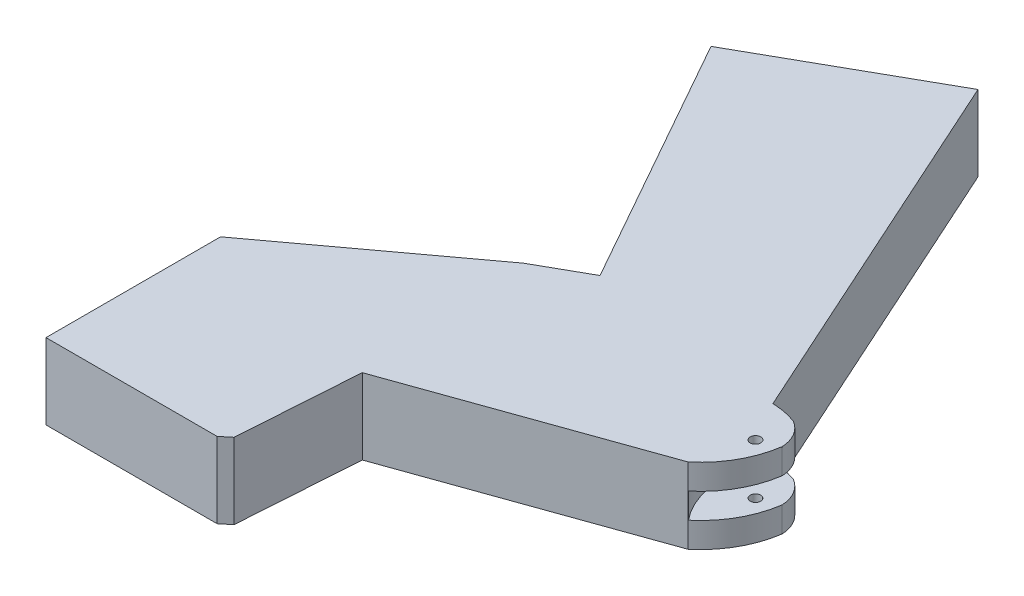
ISO-10303-21;
HEADER;
FILE_DESCRIPTION(('STEP AP214'),'2;1');
FILE_NAME('part.step','',(''),(''),'','','');
FILE_SCHEMA(('AUTOMOTIVE_DESIGN { 1 0 10303 214 1 1 1 1 }'));
ENDSEC;
DATA;
#1=APPLICATION_CONTEXT('core data for automotive mechanical design processes');
#2=APPLICATION_PROTOCOL_DEFINITION('international standard','automotive_design',2000,#1);
#3=PRODUCT_CONTEXT('',#1,'mechanical');
#4=PRODUCT('Part','Part','',(#3));
#5=PRODUCT_RELATED_PRODUCT_CATEGORY('part','',(#4));
#6=PRODUCT_DEFINITION_FORMATION('','',#4);
#7=PRODUCT_DEFINITION_CONTEXT('part definition',#1,'design');
#8=PRODUCT_DEFINITION('design','',#6,#7);
#9=PRODUCT_DEFINITION_SHAPE('','',#8);
#10=(LENGTH_UNIT() NAMED_UNIT(*) SI_UNIT(.MILLI.,.METRE.));
#11=(NAMED_UNIT(*) PLANE_ANGLE_UNIT() SI_UNIT($,.RADIAN.));
#12=(NAMED_UNIT(*) SI_UNIT($,.STERADIAN.) SOLID_ANGLE_UNIT());
#13=UNCERTAINTY_MEASURE_WITH_UNIT(LENGTH_MEASURE(1.E-05),#10,'distance_accuracy_value','');
#14=(GEOMETRIC_REPRESENTATION_CONTEXT(3) GLOBAL_UNCERTAINTY_ASSIGNED_CONTEXT((#13)) GLOBAL_UNIT_ASSIGNED_CONTEXT((#10,
#11,#12)) REPRESENTATION_CONTEXT('',''));
#15=CARTESIAN_POINT('',(0.,0.,0.));
#16=DIRECTION('',(0.,0.,1.));
#17=DIRECTION('',(1.,0.,0.));
#18=AXIS2_PLACEMENT_3D('',#15,#16,#17);
#19=CARTESIAN_POINT('',(-14.8493113907841,6.,2.40411681968589));
#20=DIRECTION('',(0.,-1.,0.));
#21=DIRECTION('',(0.,0.,-1.));
#22=AXIS2_PLACEMENT_3D('',#19,#20,#21);
#23=CYLINDRICAL_SURFACE('',#22,7.62);
#24=DIRECTION('',(0.,-1.,0.));
#25=VECTOR('',#24,1.);
#26=CARTESIAN_POINT('',(-7.30660623277179,7.07563292987973,3.4867057995369));
#27=LINE('',#26,#25);
#28=CARTESIAN_POINT('',(-7.30660623277179,6.,3.4867057995369));
#29=VERTEX_POINT('',#28);
#30=CARTESIAN_POINT('',(-7.30660623277179,4.,3.4867057995369));
#31=VERTEX_POINT('',#30);
#32=EDGE_CURVE('E209',#29,#31,#27,.T.);
#33=ORIENTED_EDGE('',*,*,#32,.F.);
#34=CARTESIAN_POINT('',(-14.8493113907841,6.,2.40411681968589));
#35=DIRECTION('',(0.,1.,0.));
#36=DIRECTION('',(0.,0.,1.));
#37=AXIS2_PLACEMENT_3D('',#34,#35,#36);
#38=CIRCLE('',#37,7.62);
#39=CARTESIAN_POINT('',(-9.98892931120867,6.,8.27276964981158));
#40=VERTEX_POINT('',#39);
#41=EDGE_CURVE('E264',#29,#40,#38,.F.);
#42=ORIENTED_EDGE('',*,*,#41,.T.);
#43=DIRECTION('',(0.,-1.,0.));
#44=VECTOR('',#43,1.);
#45=CARTESIAN_POINT('',(-9.98892931120867,6.,8.27276964981158));
#46=LINE('',#45,#44);
#47=CARTESIAN_POINT('',(-9.98892931120867,0.,8.27276964981158));
#48=VERTEX_POINT('',#47);
#49=EDGE_CURVE('E279',#40,#48,#46,.T.);
#50=ORIENTED_EDGE('',*,*,#49,.T.);
#51=CARTESIAN_POINT('',(-14.8493113907841,0.,2.40411681968589));
#52=DIRECTION('',(0.,1.,0.));
#53=DIRECTION('',(0.,0.,1.));
#54=AXIS2_PLACEMENT_3D('',#51,#52,#53);
#55=CIRCLE('',#54,7.62);
#56=CARTESIAN_POINT('',(-7.30660623277179,0.,3.4867057995369));
#57=VERTEX_POINT('',#56);
#58=EDGE_CURVE('E263',#57,#48,#55,.F.);
#59=ORIENTED_EDGE('',*,*,#58,.F.);
#60=CARTESIAN_POINT('',(-7.30660623277179,2.,3.4867057995369));
#61=VERTEX_POINT('',#60);
#62=EDGE_CURVE('E206',#61,#57,#27,.T.);
#63=ORIENTED_EDGE('',*,*,#62,.F.);
#64=CARTESIAN_POINT('',(-14.8493113907841,2.,2.40411681968589));
#65=DIRECTION('',(0.,1.,0.));
#66=DIRECTION('',(0.,0.,1.));
#67=AXIS2_PLACEMENT_3D('',#64,#65,#66);
#68=CIRCLE('',#67,7.62);
#69=CARTESIAN_POINT('',(-9.9680548829589,2.,8.25541880341689));
#70=VERTEX_POINT('',#69);
#71=EDGE_CURVE('E304',#61,#70,#68,.F.);
#72=ORIENTED_EDGE('',*,*,#71,.T.);
#73=DIRECTION('',(0.,1.,0.));
#74=VECTOR('',#73,1.);
#75=CARTESIAN_POINT('',(-9.96805488295889,3.,8.25541880341689));
#76=LINE('',#75,#74);
#77=CARTESIAN_POINT('',(-9.96805488295889,4.,8.25541880341689));
#78=VERTEX_POINT('',#77);
#79=EDGE_CURVE('E311',#78,#70,#76,.F.);
#80=ORIENTED_EDGE('',*,*,#79,.F.);
#81=CARTESIAN_POINT('',(-14.8493113907841,4.,2.40411681968589));
#82=DIRECTION('',(0.,-1.,0.));
#83=DIRECTION('',(0.,0.,-1.));
#84=AXIS2_PLACEMENT_3D('',#81,#82,#83);
#85=CIRCLE('',#84,7.62);
#86=EDGE_CURVE('E307',#78,#31,#85,.F.);
#87=ORIENTED_EDGE('',*,*,#86,.T.);
#88=EDGE_LOOP('',(#33,#42,#50,#59,#63,#72,#80,#87));
#89=FACE_BOUND('',#88,.T.);
#90=ADVANCED_FACE('F42',(#89),#23,.T.);
#91=CARTESIAN_POINT('',(-18.1082954214113,6.,-32.1657022953244));
#92=DIRECTION('',(0.490571709678532,0.,0.87140082491531));
#93=DIRECTION('',(0.87140082491531,0.,-0.490571709678532));
#94=AXIS2_PLACEMENT_3D('',#91,#92,#93);
#95=PLANE('',#94);
#96=DIRECTION('',(-0.87140082491531,0.,0.490571709678532));
#97=VECTOR('',#96,1.);
#98=CARTESIAN_POINT('',(-18.1082954214113,0.,-32.1657022953244));
#99=LINE('',#98,#97);
#100=CARTESIAN_POINT('',(-24.0712473516095,0.,-28.8087448086103));
#101=VERTEX_POINT('',#100);
#102=CARTESIAN_POINT('',(-37.6196770085618,0.,-21.1813980007664));
#103=VERTEX_POINT('',#102);
#104=EDGE_CURVE('E283',#101,#103,#99,.T.);
#105=ORIENTED_EDGE('',*,*,#104,.T.);
#106=DIRECTION('',(0.,-1.,0.));
#107=VECTOR('',#106,1.);
#108=CARTESIAN_POINT('',(-37.6196770085618,21.59,-21.1813980007664));
#109=LINE('',#108,#107);
#110=CARTESIAN_POINT('',(-37.6196770085618,6.,-21.1813980007664));
#111=VERTEX_POINT('',#110);
#112=EDGE_CURVE('E397',#111,#103,#109,.T.);
#113=ORIENTED_EDGE('',*,*,#112,.F.);
#114=DIRECTION('',(-0.87140082491531,0.,0.490571709678532));
#115=VECTOR('',#114,1.);
#116=CARTESIAN_POINT('',(-18.1082954214113,6.,-32.1657022953244));
#117=LINE('',#116,#115);
#118=CARTESIAN_POINT('',(-24.0712473516095,6.,-28.8087448086103));
#119=VERTEX_POINT('',#118);
#120=EDGE_CURVE('E268',#119,#111,#117,.T.);
#121=ORIENTED_EDGE('',*,*,#120,.F.);
#122=DIRECTION('',(0.,-1.,0.));
#123=VECTOR('',#122,1.);
#124=CARTESIAN_POINT('',(-24.0712473516095,6.,-28.8087448086103));
#125=LINE('',#124,#123);
#126=EDGE_CURVE('E300',#119,#101,#125,.T.);
#127=ORIENTED_EDGE('',*,*,#126,.T.);
#128=EDGE_LOOP('',(#105,#113,#121,#127));
#129=FACE_BOUND('',#128,.T.);
#130=ADVANCED_FACE('F395',(#129),#95,.F.);
#131=CARTESIAN_POINT('',(0.,6.,25.1912551913897));
#132=DIRECTION('',(0.,0.,1.));
#133=DIRECTION('',(1.,0.,0.));
#134=AXIS2_PLACEMENT_3D('',#131,#132,#133);
#135=PLANE('',#134);
#136=DIRECTION('',(0.,1.,0.));
#137=VECTOR('',#136,1.);
#138=CARTESIAN_POINT('',(-43.9886780467695,-2.636,25.1912551913897));
#139=LINE('',#138,#137);
#140=CARTESIAN_POINT('',(-43.9886780467695,0.,25.1912551913897));
#141=VERTEX_POINT('',#140);
#142=CARTESIAN_POINT('',(-43.9886780467695,6.,25.1912551913897));
#143=VERTEX_POINT('',#142);
#144=EDGE_CURVE('E181',#141,#143,#139,.T.);
#145=ORIENTED_EDGE('',*,*,#144,.F.);
#146=DIRECTION('',(-1.,0.,0.));
#147=VECTOR('',#146,1.);
#148=CARTESIAN_POINT('',(0.,0.,25.1912551913897));
#149=LINE('',#148,#147);
#150=CARTESIAN_POINT('',(-30.4171006832205,0.,25.1912551913897));
#151=VERTEX_POINT('',#150);
#152=EDGE_CURVE('E287',#151,#141,#149,.T.);
#153=ORIENTED_EDGE('',*,*,#152,.F.);
#154=DIRECTION('',(0.,-1.,0.));
#155=VECTOR('',#154,1.);
#156=CARTESIAN_POINT('',(-30.4171006832205,6.,25.1912551913897));
#157=LINE('',#156,#155);
#158=CARTESIAN_POINT('',(-30.4171006832205,6.,25.1912551913897));
#159=VERTEX_POINT('',#158);
#160=EDGE_CURVE('E296',#159,#151,#157,.T.);
#161=ORIENTED_EDGE('',*,*,#160,.F.);
#162=DIRECTION('',(-1.,0.,0.));
#163=VECTOR('',#162,1.);
#164=CARTESIAN_POINT('',(0.,6.,25.1912551913897));
#165=LINE('',#164,#163);
#166=EDGE_CURVE('E273',#159,#143,#165,.T.);
#167=ORIENTED_EDGE('',*,*,#166,.T.);
#168=EDGE_LOOP('',(#145,#153,#161,#167));
#169=FACE_BOUND('',#168,.T.);
#170=ADVANCED_FACE('F341',(#169),#135,.T.);
#171=CARTESIAN_POINT('',(0.,6.,0.));
#172=DIRECTION('',(0.637845417267118,0.,0.770164413402318));
#173=DIRECTION('',(0.770164413402318,0.,-0.637845417267118));
#174=AXIS2_PLACEMENT_3D('',#171,#172,#173);
#175=PLANE('',#174);
#176=DIRECTION('',(0.,1.,0.));
#177=VECTOR('',#176,1.);
#178=CARTESIAN_POINT('',(-29.6827449710314,-2.636,24.5830663196207));
#179=LINE('',#178,#177);
#180=CARTESIAN_POINT('',(-29.6827449710314,0.,24.5830663196207));
#181=VERTEX_POINT('',#180);
#182=CARTESIAN_POINT('',(-29.6827449710314,6.,24.5830663196207));
#183=VERTEX_POINT('',#182);
#184=EDGE_CURVE('E197',#181,#183,#179,.T.);
#185=ORIENTED_EDGE('',*,*,#184,.T.);
#186=DIRECTION('',(-0.770164413402318,0.,0.637845417267118));
#187=VECTOR('',#186,1.);
#188=CARTESIAN_POINT('',(0.,6.,0.));
#189=LINE('',#188,#187);
#190=EDGE_CURVE('E276',#183,#159,#189,.T.);
#191=ORIENTED_EDGE('',*,*,#190,.T.);
#192=ORIENTED_EDGE('',*,*,#160,.T.);
#193=DIRECTION('',(-0.770164413402318,0.,0.637845417267118));
#194=VECTOR('',#193,1.);
#195=CARTESIAN_POINT('',(0.,0.,0.));
#196=LINE('',#195,#194);
#197=EDGE_CURVE('E269',#181,#151,#196,.T.);
#198=ORIENTED_EDGE('',*,*,#197,.F.);
#199=EDGE_LOOP('',(#185,#191,#192,#198));
#200=FACE_BOUND('',#199,.T.);
#201=ADVANCED_FACE('F347',(#200),#175,.T.);
#202=CARTESIAN_POINT('',(0.,6.,0.));
#203=DIRECTION('',(0.,1.,0.));
#204=DIRECTION('',(0.,0.,1.));
#205=AXIS2_PLACEMENT_3D('',#202,#203,#204);
#206=PLANE('',#205);
#207=DIRECTION('',(0.804518569535562,0.,-0.593927496646226));
#208=VECTOR('',#207,1.);
#209=CARTESIAN_POINT('',(-43.9886780467695,6.,11.3487528444307));
#210=LINE('',#209,#208);
#211=CARTESIAN_POINT('',(-43.9886780467695,6.,11.3487528444307));
#212=VERTEX_POINT('',#211);
#213=CARTESIAN_POINT('',(-30.168184758932,6.,1.14591689795911));
#214=VERTEX_POINT('',#213);
#215=EDGE_CURVE('E57',#212,#214,#210,.T.);
#216=ORIENTED_EDGE('',*,*,#215,.F.);
#217=DIRECTION('',(0.,0.,-1.));
#218=VECTOR('',#217,1.);
#219=CARTESIAN_POINT('',(-43.9886780467695,6.,11.6547363179189));
#220=LINE('',#219,#218);
#221=EDGE_CURVE('E173',#143,#212,#220,.T.);
#222=ORIENTED_EDGE('',*,*,#221,.F.);
#223=ORIENTED_EDGE('',*,*,#166,.F.);
#224=ORIENTED_EDGE('',*,*,#190,.F.);
#225=DIRECTION('',(-0.0674383179263004,0.,0.997723445286955));
#226=VECTOR('',#225,1.);
#227=CARTESIAN_POINT('',(-29.0389293112087,6.,15.0580663196207));
#228=LINE('',#227,#226);
#229=CARTESIAN_POINT('',(-29.0389293112087,6.,15.0580663196207));
#230=VERTEX_POINT('',#229);
#231=EDGE_CURVE('E194',#230,#183,#228,.T.);
#232=ORIENTED_EDGE('',*,*,#231,.F.);
#233=DIRECTION('',(-0.942027807811241,0.,0.335534810877123));
#234=VECTOR('',#233,1.);
#235=CARTESIAN_POINT('',(-9.98892931120867,6.,8.27276964981158));
#236=LINE('',#235,#234);
#237=EDGE_CURVE('E187',#40,#230,#236,.T.);
#238=ORIENTED_EDGE('',*,*,#237,.F.);
#239=ORIENTED_EDGE('',*,*,#41,.F.);
#240=CARTESIAN_POINT('',(-9.98364937034134,6.,3.59758900011927));
#241=DIRECTION('',(0.,1.,0.));
#242=DIRECTION('',(0.,0.,1.));
#243=AXIS2_PLACEMENT_3D('',#240,#241,#242);
#244=CIRCLE('',#243,2.67933854609297);
#245=CARTESIAN_POINT('',(-8.62136943104779,6.,1.29041574880545));
#246=VERTEX_POINT('',#245);
#247=EDGE_CURVE('E216',#246,#29,#244,.F.);
#248=ORIENTED_EDGE('',*,*,#247,.F.);
#249=CARTESIAN_POINT('',(-10.8359982452345,6.,7.30428652137745));
#250=DIRECTION('',(0.,1.,0.));
#251=DIRECTION('',(0.,0.,1.));
#252=AXIS2_PLACEMENT_3D('',#249,#250,#251);
#253=CIRCLE('',#252,6.40868336351716);
#254=CARTESIAN_POINT('',(-10.6277891761241,6.,0.898986260081204));
#255=VERTEX_POINT('',#254);
#256=EDGE_CURVE('E236',#255,#246,#253,.F.);
#257=ORIENTED_EDGE('',*,*,#256,.F.);
#258=DIRECTION('',(0.412275972496005,0.,0.911059011536834));
#259=VECTOR('',#258,1.);
#260=CARTESIAN_POINT('',(-9.15903434475053,6.,4.14468189633144));
#261=LINE('',#260,#259);
#262=EDGE_CURVE('E240',#119,#255,#261,.T.);
#263=ORIENTED_EDGE('',*,*,#262,.F.);
#264=ORIENTED_EDGE('',*,*,#120,.T.);
#265=DIRECTION('',(-0.490571709678532,0.,-0.87140082491531));
#266=VECTOR('',#265,1.);
#267=CARTESIAN_POINT('',(-19.5113815871505,6.,10.984304294558));
#268=LINE('',#267,#266);
#269=CARTESIAN_POINT('',(-26.2818132844904,6.,-1.04199002632913));
#270=VERTEX_POINT('',#269);
#271=EDGE_CURVE('E183',#270,#111,#268,.T.);
#272=ORIENTED_EDGE('',*,*,#271,.F.);
#273=DIRECTION('',(0.87140082491531,0.,-0.490571709678532));
#274=VECTOR('',#273,1.);
#275=CARTESIAN_POINT('',(-6.77043169733998,6.,-12.0262943208871));
#276=LINE('',#275,#274);
#277=EDGE_CURVE('E176',#214,#270,#276,.T.);
#278=ORIENTED_EDGE('',*,*,#277,.F.);
#279=EDGE_LOOP('',(#216,#222,#223,#224,#232,#238,#239,#248,#257,#263,#264,#272,#278));
#280=FACE_BOUND('',#279,.T.);
#281=CARTESIAN_POINT('',(-8.82560150885325,6.,4.08649908563996));
#282=DIRECTION('',(0.,1.,0.));
#283=DIRECTION('',(0.,0.,1.));
#284=AXIS2_PLACEMENT_3D('',#281,#282,#283);
#285=CIRCLE('',#284,0.418238454159336);
#286=CARTESIAN_POINT('',(-8.82560150885325,6.,4.5047375397993));
#287=VERTEX_POINT('',#286);
#288=EDGE_CURVE('E243',#287,#287,#285,.T.);
#289=ORIENTED_EDGE('',*,*,#288,.F.);
#290=EDGE_LOOP('',(#289));
#291=FACE_BOUND('',#290,.T.);
#292=ADVANCED_FACE('F170',(#280,#291),#206,.T.);
#293=CARTESIAN_POINT('',(0.,0.,0.));
#294=DIRECTION('',(0.,1.,0.));
#295=DIRECTION('',(0.,0.,1.));
#296=AXIS2_PLACEMENT_3D('',#293,#294,#295);
#297=PLANE('',#296);
#298=CARTESIAN_POINT('',(-8.82560150885325,0.,4.08649908563996));
#299=DIRECTION('',(0.,1.,0.));
#300=DIRECTION('',(0.,0.,1.));
#301=AXIS2_PLACEMENT_3D('',#298,#299,#300);
#302=CIRCLE('',#301,0.418238454159336);
#303=CARTESIAN_POINT('',(-8.82560150885325,0.,4.5047375397993));
#304=VERTEX_POINT('',#303);
#305=EDGE_CURVE('E244',#304,#304,#302,.T.);
#306=ORIENTED_EDGE('',*,*,#305,.T.);
#307=EDGE_LOOP('',(#306));
#308=FACE_BOUND('',#307,.T.);
#309=DIRECTION('',(0.,0.,-1.));
#310=VECTOR('',#309,1.);
#311=CARTESIAN_POINT('',(-43.9886780467695,0.,0.));
#312=LINE('',#311,#310);
#313=CARTESIAN_POINT('',(-43.9886780467695,0.,11.3487528444307));
#314=VERTEX_POINT('',#313);
#315=EDGE_CURVE('E50',#141,#314,#312,.T.);
#316=ORIENTED_EDGE('',*,*,#315,.T.);
#317=DIRECTION('',(0.804518569535562,0.,-0.593927496646226));
#318=VECTOR('',#317,1.);
#319=CARTESIAN_POINT('',(-10.0942747463166,0.,-13.6734391407423));
#320=LINE('',#319,#318);
#321=CARTESIAN_POINT('',(-30.168184758932,0.,1.1459168979591));
#322=VERTEX_POINT('',#321);
#323=EDGE_CURVE('E161',#314,#322,#320,.T.);
#324=ORIENTED_EDGE('',*,*,#323,.T.);
#325=DIRECTION('',(-0.87140082491531,0.,0.490571709678532));
#326=VECTOR('',#325,1.);
#327=CARTESIAN_POINT('',(-43.9886780467695,0.,8.92642711433864));
#328=LINE('',#327,#326);
#329=CARTESIAN_POINT('',(-26.2818132844904,0.,-1.04199002632913));
#330=VERTEX_POINT('',#329);
#331=EDGE_CURVE('E590',#330,#322,#328,.T.);
#332=ORIENTED_EDGE('',*,*,#331,.F.);
#333=DIRECTION('',(0.490571709678532,0.,0.87140082491531));
#334=VECTOR('',#333,1.);
#335=CARTESIAN_POINT('',(-26.2818132844904,0.,-1.04199002632913));
#336=LINE('',#335,#334);
#337=EDGE_CURVE('E595',#103,#330,#336,.T.);
#338=ORIENTED_EDGE('',*,*,#337,.F.);
#339=ORIENTED_EDGE('',*,*,#104,.F.);
#340=DIRECTION('',(-0.412275972496005,0.,-0.911059011536834));
#341=VECTOR('',#340,1.);
#342=CARTESIAN_POINT('',(-24.0712473516095,0.,-28.8087448086103));
#343=LINE('',#342,#341);
#344=CARTESIAN_POINT('',(-10.6277891761241,0.,0.898986260081204));
#345=VERTEX_POINT('',#344);
#346=EDGE_CURVE('E222',#345,#101,#343,.T.);
#347=ORIENTED_EDGE('',*,*,#346,.F.);
#348=CARTESIAN_POINT('',(-10.8359982452345,0.,7.30428652137745));
#349=DIRECTION('',(0.,1.,0.));
#350=DIRECTION('',(0.,0.,-1.));
#351=AXIS2_PLACEMENT_3D('',#348,#349,#350);
#352=CIRCLE('',#351,6.40868336351716);
#353=CARTESIAN_POINT('',(-8.62136943104779,0.,1.29041574880545));
#354=VERTEX_POINT('',#353);
#355=EDGE_CURVE('E219',#354,#345,#352,.T.);
#356=ORIENTED_EDGE('',*,*,#355,.F.);
#357=CARTESIAN_POINT('',(-9.98364937034134,0.,3.59758900011927));
#358=DIRECTION('',(0.,1.,0.));
#359=DIRECTION('',(0.,0.,-1.));
#360=AXIS2_PLACEMENT_3D('',#357,#358,#359);
#361=CIRCLE('',#360,2.67933854609297);
#362=EDGE_CURVE('E201',#57,#354,#361,.T.);
#363=ORIENTED_EDGE('',*,*,#362,.F.);
#364=ORIENTED_EDGE('',*,*,#58,.T.);
#365=DIRECTION('',(-0.942027807811242,0.,0.335534810877123));
#366=VECTOR('',#365,1.);
#367=CARTESIAN_POINT('',(1.49029314626835,0.,4.18405941817291));
#368=LINE('',#367,#366);
#369=CARTESIAN_POINT('',(-29.0389293112087,0.,15.0580663196207));
#370=VERTEX_POINT('',#369);
#371=EDGE_CURVE('E327',#48,#370,#368,.T.);
#372=ORIENTED_EDGE('',*,*,#371,.T.);
#373=DIRECTION('',(-0.0674383179263004,0.,0.997723445286955));
#374=VECTOR('',#373,1.);
#375=CARTESIAN_POINT('',(-27.8936835447756,0.,-1.88539530459482));
#376=LINE('',#375,#374);
#377=EDGE_CURVE('E331',#370,#181,#376,.T.);
#378=ORIENTED_EDGE('',*,*,#377,.T.);
#379=ORIENTED_EDGE('',*,*,#197,.T.);
#380=ORIENTED_EDGE('',*,*,#152,.T.);
#381=EDGE_LOOP('',(#316,#324,#332,#338,#339,#347,#356,#363,#364,#372,#378,#379,#380));
#382=FACE_BOUND('',#381,.T.);
#383=ADVANCED_FACE('F336',(#308,#382),#297,.F.);
#384=CARTESIAN_POINT('',(0.,4.,0.));
#385=DIRECTION('',(0.,-1.,0.));
#386=DIRECTION('',(0.,0.,-1.));
#387=AXIS2_PLACEMENT_3D('',#384,#385,#386);
#388=PLANE('',#387);
#389=CARTESIAN_POINT('',(-9.98364937034134,4.,3.59758900011927));
#390=DIRECTION('',(0.,-1.,0.));
#391=DIRECTION('',(0.,0.,-1.));
#392=AXIS2_PLACEMENT_3D('',#389,#390,#391);
#393=CIRCLE('',#392,2.67933854609297);
#394=CARTESIAN_POINT('',(-8.62136943104779,4.,1.29041574880545));
#395=VERTEX_POINT('',#394);
#396=EDGE_CURVE('E213',#31,#395,#393,.F.);
#397=ORIENTED_EDGE('',*,*,#396,.F.);
#398=ORIENTED_EDGE('',*,*,#86,.F.);
#399=CARTESIAN_POINT('',(-5.032284182456,4.,4.16770672379616));
#400=DIRECTION('',(0.,1.,0.));
#401=DIRECTION('',(0.,0.,1.));
#402=AXIS2_PLACEMENT_3D('',#399,#400,#401);
#403=CIRCLE('',#402,6.40868336351704);
#404=CARTESIAN_POINT('',(-10.5465666250149,4.,0.902142209427068));
#405=VERTEX_POINT('',#404);
#406=EDGE_CURVE('E256',#405,#78,#403,.T.);
#407=ORIENTED_EDGE('',*,*,#406,.F.);
#408=CARTESIAN_POINT('',(-10.8359982452345,4.,7.30428652137745));
#409=DIRECTION('',(0.,-1.,0.));
#410=DIRECTION('',(0.,0.,-1.));
#411=AXIS2_PLACEMENT_3D('',#408,#409,#410);
#412=CIRCLE('',#411,6.40868336351716);
#413=EDGE_CURVE('E233',#395,#405,#412,.F.);
#414=ORIENTED_EDGE('',*,*,#413,.F.);
#415=EDGE_LOOP('',(#397,#398,#407,#414));
#416=FACE_BOUND('',#415,.T.);
#417=CARTESIAN_POINT('',(-8.82560150885325,4.,4.08649908563996));
#418=DIRECTION('',(0.,-1.,0.));
#419=DIRECTION('',(0.,0.,-1.));
#420=AXIS2_PLACEMENT_3D('',#417,#418,#419);
#421=CIRCLE('',#420,0.418238454159336);
#422=CARTESIAN_POINT('',(-8.82560150885325,4.,3.66826063148062));
#423=VERTEX_POINT('',#422);
#424=EDGE_CURVE('E252',#423,#423,#421,.T.);
#425=ORIENTED_EDGE('',*,*,#424,.F.);
#426=EDGE_LOOP('',(#425));
#427=FACE_BOUND('',#426,.T.);
#428=ADVANCED_FACE('F372',(#416,#427),#388,.T.);
#429=CARTESIAN_POINT('',(0.,2.,0.));
#430=DIRECTION('',(0.,1.,0.));
#431=DIRECTION('',(0.,0.,1.));
#432=AXIS2_PLACEMENT_3D('',#429,#430,#431);
#433=PLANE('',#432);
#434=CARTESIAN_POINT('',(-9.98364937034134,2.,3.59758900011927));
#435=DIRECTION('',(0.,1.,0.));
#436=DIRECTION('',(0.,0.,1.));
#437=AXIS2_PLACEMENT_3D('',#434,#435,#436);
#438=CIRCLE('',#437,2.67933854609297);
#439=CARTESIAN_POINT('',(-8.62136943104779,2.,1.29041574880545));
#440=VERTEX_POINT('',#439);
#441=EDGE_CURVE('E210',#440,#61,#438,.F.);
#442=ORIENTED_EDGE('',*,*,#441,.F.);
#443=CARTESIAN_POINT('',(-10.8359982452345,2.,7.30428652137745));
#444=DIRECTION('',(0.,1.,0.));
#445=DIRECTION('',(0.,0.,1.));
#446=AXIS2_PLACEMENT_3D('',#443,#444,#445);
#447=CIRCLE('',#446,6.40868336351716);
#448=CARTESIAN_POINT('',(-10.5465666250149,2.,0.902142209427068));
#449=VERTEX_POINT('',#448);
#450=EDGE_CURVE('E229',#449,#440,#447,.F.);
#451=ORIENTED_EDGE('',*,*,#450,.F.);
#452=CARTESIAN_POINT('',(-5.032284182456,2.,4.16770672379616));
#453=DIRECTION('',(0.,1.,0.));
#454=DIRECTION('',(0.,0.,1.));
#455=AXIS2_PLACEMENT_3D('',#452,#453,#454);
#456=CIRCLE('',#455,6.40868336351704);
#457=EDGE_CURVE('E259',#449,#70,#456,.T.);
#458=ORIENTED_EDGE('',*,*,#457,.T.);
#459=ORIENTED_EDGE('',*,*,#71,.F.);
#460=EDGE_LOOP('',(#442,#451,#458,#459));
#461=FACE_BOUND('',#460,.T.);
#462=CARTESIAN_POINT('',(-8.82560150885325,2.,4.08649908563996));
#463=DIRECTION('',(0.,1.,0.));
#464=DIRECTION('',(0.,0.,1.));
#465=AXIS2_PLACEMENT_3D('',#462,#463,#464);
#466=CIRCLE('',#465,0.418238454159336);
#467=CARTESIAN_POINT('',(-8.82560150885325,2.,4.5047375397993));
#468=VERTEX_POINT('',#467);
#469=EDGE_CURVE('E248',#468,#468,#466,.T.);
#470=ORIENTED_EDGE('',*,*,#469,.F.);
#471=EDGE_LOOP('',(#470));
#472=FACE_BOUND('',#471,.T.);
#473=ADVANCED_FACE('F380',(#461,#472),#433,.T.);
#474=CARTESIAN_POINT('',(-5.032284182456,4.,4.16770672379616));
#475=DIRECTION('',(0.,1.,0.));
#476=DIRECTION('',(0.,0.,1.));
#477=AXIS2_PLACEMENT_3D('',#474,#475,#476);
#478=CYLINDRICAL_SURFACE('',#477,6.40868336351704);
#479=ORIENTED_EDGE('',*,*,#457,.F.);
#480=DIRECTION('',(0.,-1.,0.));
#481=VECTOR('',#480,1.);
#482=CARTESIAN_POINT('',(-10.5465666250149,3.53781646493986,0.902142209427066));
#483=LINE('',#482,#481);
#484=EDGE_CURVE('E315',#449,#405,#483,.F.);
#485=ORIENTED_EDGE('',*,*,#484,.T.);
#486=ORIENTED_EDGE('',*,*,#406,.T.);
#487=ORIENTED_EDGE('',*,*,#79,.T.);
#488=EDGE_LOOP('',(#479,#485,#486,#487));
#489=FACE_BOUND('',#488,.T.);
#490=ADVANCED_FACE('F376',(#489),#478,.F.);
#491=CARTESIAN_POINT('',(-8.82560150885325,0.,4.08649908563996));
#492=DIRECTION('',(0.,1.,0.));
#493=DIRECTION('',(0.,0.,1.));
#494=AXIS2_PLACEMENT_3D('',#491,#492,#493);
#495=CYLINDRICAL_SURFACE('',#494,0.418238454159336);
#496=ORIENTED_EDGE('',*,*,#469,.T.);
#497=EDGE_LOOP('',(#496));
#498=FACE_BOUND('',#497,.T.);
#499=ORIENTED_EDGE('',*,*,#305,.F.);
#500=EDGE_LOOP('',(#499));
#501=FACE_BOUND('',#500,.T.);
#502=ADVANCED_FACE('F430',(#498,#501),#495,.F.);
#503=ORIENTED_EDGE('',*,*,#424,.T.);
#504=EDGE_LOOP('',(#503));
#505=FACE_BOUND('',#504,.T.);
#506=ORIENTED_EDGE('',*,*,#288,.T.);
#507=EDGE_LOOP('',(#506));
#508=FACE_BOUND('',#507,.T.);
#509=ADVANCED_FACE('F433',(#505,#508),#495,.F.);
#510=CARTESIAN_POINT('',(-24.0712473516095,7.07563292987973,-28.8087448086103));
#511=DIRECTION('',(-0.911059011536834,0.,0.412275972496005));
#512=DIRECTION('',(0.412275972496005,0.,0.911059011536834));
#513=AXIS2_PLACEMENT_3D('',#510,#511,#512);
#514=PLANE('',#513);
#515=ORIENTED_EDGE('',*,*,#262,.T.);
#516=DIRECTION('',(0.,-1.,0.));
#517=VECTOR('',#516,1.);
#518=CARTESIAN_POINT('',(-10.6277891761241,7.07563292987973,0.898986260081204));
#519=LINE('',#518,#517);
#520=EDGE_CURVE('E225',#255,#345,#519,.T.);
#521=ORIENTED_EDGE('',*,*,#520,.T.);
#522=ORIENTED_EDGE('',*,*,#346,.T.);
#523=ORIENTED_EDGE('',*,*,#126,.F.);
#524=EDGE_LOOP('',(#515,#521,#522,#523));
#525=FACE_BOUND('',#524,.T.);
#526=ADVANCED_FACE('F391',(#525),#514,.F.);
#527=CARTESIAN_POINT('',(-10.8359982452345,7.07563292987973,7.30428652137745));
#528=DIRECTION('',(0.,-1.,0.));
#529=DIRECTION('',(0.,0.,-1.));
#530=AXIS2_PLACEMENT_3D('',#527,#528,#529);
#531=CYLINDRICAL_SURFACE('',#530,6.40868336351716);
#532=ORIENTED_EDGE('',*,*,#256,.T.);
#533=DIRECTION('',(0.,-1.,0.));
#534=VECTOR('',#533,1.);
#535=CARTESIAN_POINT('',(-8.62136943104779,7.07563292987973,1.29041574880545));
#536=LINE('',#535,#534);
#537=EDGE_CURVE('E326',#246,#395,#536,.T.);
#538=ORIENTED_EDGE('',*,*,#537,.T.);
#539=ORIENTED_EDGE('',*,*,#413,.T.);
#540=ORIENTED_EDGE('',*,*,#484,.F.);
#541=ORIENTED_EDGE('',*,*,#450,.T.);
#542=EDGE_CURVE('E322',#440,#354,#536,.T.);
#543=ORIENTED_EDGE('',*,*,#542,.T.);
#544=ORIENTED_EDGE('',*,*,#355,.T.);
#545=ORIENTED_EDGE('',*,*,#520,.F.);
#546=EDGE_LOOP('',(#532,#538,#539,#540,#541,#543,#544,#545));
#547=FACE_BOUND('',#546,.T.);
#548=ADVANCED_FACE('F367',(#547),#531,.T.);
#549=CARTESIAN_POINT('',(-9.98364937034134,7.07563292987973,3.59758900011927));
#550=DIRECTION('',(0.,-1.,0.));
#551=DIRECTION('',(0.,0.,-1.));
#552=AXIS2_PLACEMENT_3D('',#549,#550,#551);
#553=CYLINDRICAL_SURFACE('',#552,2.67933854609297);
#554=ORIENTED_EDGE('',*,*,#441,.T.);
#555=ORIENTED_EDGE('',*,*,#62,.T.);
#556=ORIENTED_EDGE('',*,*,#362,.T.);
#557=ORIENTED_EDGE('',*,*,#542,.F.);
#558=EDGE_LOOP('',(#554,#555,#556,#557));
#559=FACE_BOUND('',#558,.T.);
#560=ADVANCED_FACE('F385',(#559),#553,.T.);
#561=ORIENTED_EDGE('',*,*,#247,.T.);
#562=ORIENTED_EDGE('',*,*,#32,.T.);
#563=ORIENTED_EDGE('',*,*,#396,.T.);
#564=ORIENTED_EDGE('',*,*,#537,.F.);
#565=EDGE_LOOP('',(#561,#562,#563,#564));
#566=FACE_BOUND('',#565,.T.);
#567=ADVANCED_FACE('F398',(#566),#553,.T.);
#568=CARTESIAN_POINT('',(-29.0389293112087,-2.636,15.0580663196207));
#569=DIRECTION('',(-0.997723445286955,0.,-0.0674383179263004));
#570=DIRECTION('',(-0.0674383179263004,0.,0.997723445286955));
#571=AXIS2_PLACEMENT_3D('',#568,#569,#570);
#572=PLANE('',#571);
#573=DIRECTION('',(0.,1.,0.));
#574=VECTOR('',#573,1.);
#575=CARTESIAN_POINT('',(-29.0389293112087,-2.636,15.0580663196207));
#576=LINE('',#575,#574);
#577=EDGE_CURVE('E64',#370,#230,#576,.T.);
#578=ORIENTED_EDGE('',*,*,#577,.T.);
#579=ORIENTED_EDGE('',*,*,#231,.T.);
#580=ORIENTED_EDGE('',*,*,#184,.F.);
#581=ORIENTED_EDGE('',*,*,#377,.F.);
#582=EDGE_LOOP('',(#578,#579,#580,#581));
#583=FACE_BOUND('',#582,.T.);
#584=ADVANCED_FACE('F350',(#583),#572,.F.);
#585=CARTESIAN_POINT('',(-9.98892931120867,-2.636,8.27276964981158));
#586=DIRECTION('',(-0.335534810877123,0.,-0.942027807811242));
#587=DIRECTION('',(-0.942027807811242,0.,0.335534810877123));
#588=AXIS2_PLACEMENT_3D('',#585,#586,#587);
#589=PLANE('',#588);
#590=ORIENTED_EDGE('',*,*,#49,.F.);
#591=ORIENTED_EDGE('',*,*,#237,.T.);
#592=ORIENTED_EDGE('',*,*,#577,.F.);
#593=ORIENTED_EDGE('',*,*,#371,.F.);
#594=EDGE_LOOP('',(#590,#591,#592,#593));
#595=FACE_BOUND('',#594,.T.);
#596=ADVANCED_FACE('F353',(#595),#589,.F.);
#597=CARTESIAN_POINT('',(-43.9886780467695,-2.636,11.6547363179189));
#598=DIRECTION('',(1.,0.,0.));
#599=DIRECTION('',(0.,0.,-1.));
#600=AXIS2_PLACEMENT_3D('',#597,#598,#599);
#601=PLANE('',#600);
#602=ORIENTED_EDGE('',*,*,#221,.T.);
#603=DIRECTION('',(0.,1.,0.));
#604=VECTOR('',#603,1.);
#605=CARTESIAN_POINT('',(-43.9886780467695,-14.574,11.3487528444307));
#606=LINE('',#605,#604);
#607=EDGE_CURVE('E158',#314,#212,#606,.T.);
#608=ORIENTED_EDGE('',*,*,#607,.F.);
#609=ORIENTED_EDGE('',*,*,#315,.F.);
#610=ORIENTED_EDGE('',*,*,#144,.T.);
#611=EDGE_LOOP('',(#602,#608,#609,#610));
#612=FACE_BOUND('',#611,.T.);
#613=ADVANCED_FACE('F179',(#612),#601,.F.);
#614=CARTESIAN_POINT('',(-43.9886780467695,21.59,8.92642711433864));
#615=DIRECTION('',(0.490571709678532,0.,0.87140082491531));
#616=DIRECTION('',(0.87140082491531,0.,-0.490571709678532));
#617=AXIS2_PLACEMENT_3D('',#614,#615,#616);
#618=PLANE('',#617);
#619=ORIENTED_EDGE('',*,*,#331,.T.);
#620=DIRECTION('',(0.,1.,0.));
#621=VECTOR('',#620,1.);
#622=CARTESIAN_POINT('',(-30.168184758932,21.59,1.14591689795911));
#623=LINE('',#622,#621);
#624=EDGE_CURVE('E12',#322,#214,#623,.T.);
#625=ORIENTED_EDGE('',*,*,#624,.T.);
#626=ORIENTED_EDGE('',*,*,#277,.T.);
#627=DIRECTION('',(0.,-1.,0.));
#628=VECTOR('',#627,1.);
#629=CARTESIAN_POINT('',(-26.2818132844904,21.59,-1.04199002632913));
#630=LINE('',#629,#628);
#631=EDGE_CURVE('E592',#270,#330,#630,.T.);
#632=ORIENTED_EDGE('',*,*,#631,.T.);
#633=EDGE_LOOP('',(#619,#625,#626,#632));
#634=FACE_BOUND('',#633,.T.);
#635=ADVANCED_FACE('F499',(#634),#618,.F.);
#636=CARTESIAN_POINT('',(-26.2818132844904,21.59,-1.04199002632913));
#637=DIRECTION('',(0.87140082491531,0.,-0.490571709678532));
#638=DIRECTION('',(-0.490571709678532,0.,-0.87140082491531));
#639=AXIS2_PLACEMENT_3D('',#636,#637,#638);
#640=PLANE('',#639);
#641=ORIENTED_EDGE('',*,*,#271,.T.);
#642=ORIENTED_EDGE('',*,*,#112,.T.);
#643=ORIENTED_EDGE('',*,*,#337,.T.);
#644=ORIENTED_EDGE('',*,*,#631,.F.);
#645=EDGE_LOOP('',(#641,#642,#643,#644));
#646=FACE_BOUND('',#645,.T.);
#647=ADVANCED_FACE('F495',(#646),#640,.F.);
#648=CARTESIAN_POINT('',(-43.9886780467695,-14.574,11.3487528444307));
#649=DIRECTION('',(0.593927496646226,0.,0.804518569535562));
#650=DIRECTION('',(0.804518569535562,0.,-0.593927496646226));
#651=AXIS2_PLACEMENT_3D('',#648,#649,#650);
#652=PLANE('',#651);
#653=ORIENTED_EDGE('',*,*,#607,.T.);
#654=ORIENTED_EDGE('',*,*,#215,.T.);
#655=ORIENTED_EDGE('',*,*,#624,.F.);
#656=ORIENTED_EDGE('',*,*,#323,.F.);
#657=EDGE_LOOP('',(#653,#654,#655,#656));
#658=FACE_BOUND('',#657,.T.);
#659=ADVANCED_FACE('F159',(#658),#652,.F.);
#660=CLOSED_SHELL('',(#90,#130,#170,#201,#292,#383,#428,#473,#490,#502,#509,#526,#548,#560,#567,
#584,#596,#613,#635,#647,#659));
#661=MANIFOLD_SOLID_BREP('B2',#660);
#662=ADVANCED_BREP_SHAPE_REPRESENTATION('',(#18,#661),#14);
#663=SHAPE_DEFINITION_REPRESENTATION(#9,#662);
ENDSEC;
END-ISO-10303-21;
